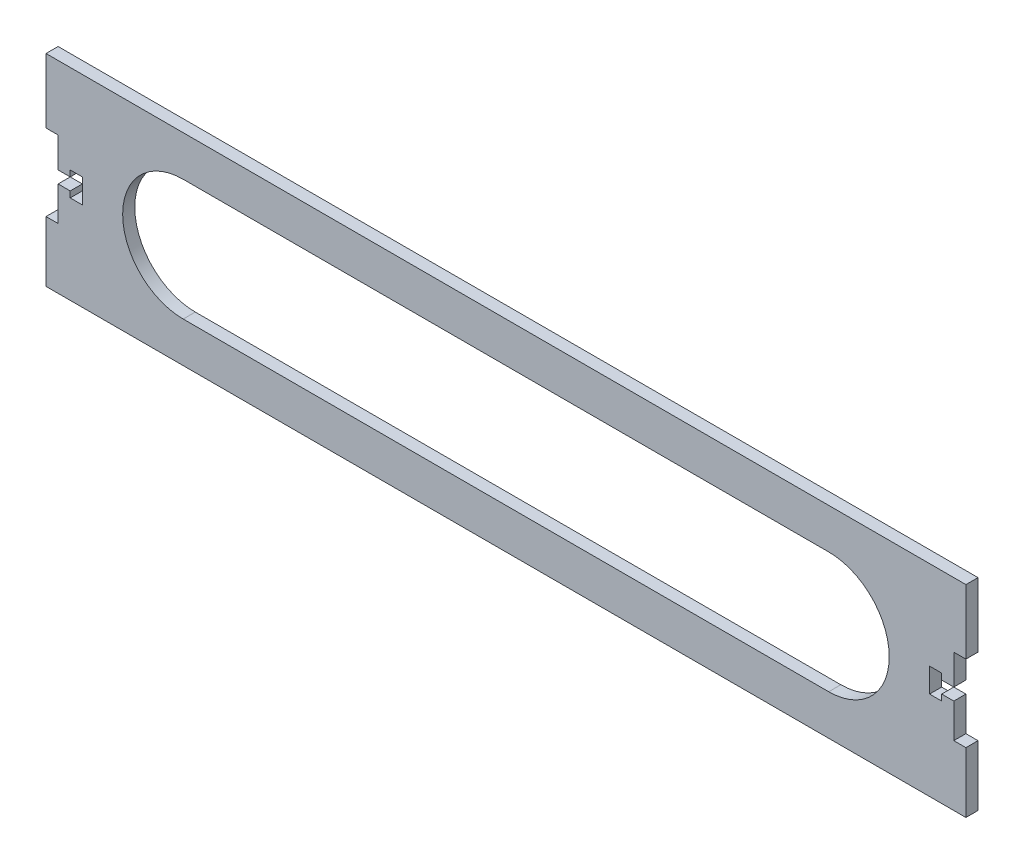
ISO-10303-21;
HEADER;
FILE_DESCRIPTION(('STEP AP214'),'2;1');
FILE_NAME('part.step','',(''),(''),'','','');
FILE_SCHEMA(('AUTOMOTIVE_DESIGN { 1 0 10303 214 1 1 1 1 }'));
ENDSEC;
DATA;
#1=APPLICATION_CONTEXT('core data for automotive mechanical design processes');
#2=APPLICATION_PROTOCOL_DEFINITION('international standard','automotive_design',2000,#1);
#3=PRODUCT_CONTEXT('',#1,'mechanical');
#4=PRODUCT('Part','Part','',(#3));
#5=PRODUCT_RELATED_PRODUCT_CATEGORY('part','',(#4));
#6=PRODUCT_DEFINITION_FORMATION('','',#4);
#7=PRODUCT_DEFINITION_CONTEXT('part definition',#1,'design');
#8=PRODUCT_DEFINITION('design','',#6,#7);
#9=PRODUCT_DEFINITION_SHAPE('','',#8);
#10=(LENGTH_UNIT() NAMED_UNIT(*) SI_UNIT(.MILLI.,.METRE.));
#11=(NAMED_UNIT(*) PLANE_ANGLE_UNIT() SI_UNIT($,.RADIAN.));
#12=(NAMED_UNIT(*) SI_UNIT($,.STERADIAN.) SOLID_ANGLE_UNIT());
#13=UNCERTAINTY_MEASURE_WITH_UNIT(LENGTH_MEASURE(1.E-05),#10,'distance_accuracy_value','');
#14=(GEOMETRIC_REPRESENTATION_CONTEXT(3) GLOBAL_UNCERTAINTY_ASSIGNED_CONTEXT((#13)) GLOBAL_UNIT_ASSIGNED_CONTEXT((#10,
#11,#12)) REPRESENTATION_CONTEXT('',''));
#15=CARTESIAN_POINT('',(0.,0.,0.));
#16=DIRECTION('',(0.,0.,1.));
#17=DIRECTION('',(1.,0.,0.));
#18=AXIS2_PLACEMENT_3D('',#15,#16,#17);
#19=CARTESIAN_POINT('',(-111.,-25.,3.));
#20=DIRECTION('',(1.,0.,0.));
#21=DIRECTION('',(0.,0.,-1.));
#22=AXIS2_PLACEMENT_3D('',#19,#20,#21);
#23=PLANE('',#22);
#24=DIRECTION('',(0.,0.,-1.));
#25=VECTOR('',#24,1.);
#26=CARTESIAN_POINT('',(-111.,-9.99999999999999,3.));
#27=LINE('',#26,#25);
#28=CARTESIAN_POINT('',(-111.,-9.99999999999999,3.));
#29=VERTEX_POINT('',#28);
#30=CARTESIAN_POINT('',(-111.,-9.99999999999999,0.));
#31=VERTEX_POINT('',#30);
#32=EDGE_CURVE('E302',#29,#31,#27,.T.);
#33=ORIENTED_EDGE('',*,*,#32,.F.);
#34=DIRECTION('',(0.,-1.,0.));
#35=VECTOR('',#34,1.);
#36=CARTESIAN_POINT('',(-111.,-25.,3.));
#37=LINE('',#36,#35);
#38=CARTESIAN_POINT('',(-111.,-1.50000000000002,3.));
#39=VERTEX_POINT('',#38);
#40=EDGE_CURVE('E381',#39,#29,#37,.T.);
#41=ORIENTED_EDGE('',*,*,#40,.F.);
#42=DIRECTION('',(0.,0.,-1.));
#43=VECTOR('',#42,1.);
#44=CARTESIAN_POINT('',(-111.,-1.50000000000002,3.));
#45=LINE('',#44,#43);
#46=CARTESIAN_POINT('',(-111.,-1.50000000000002,0.));
#47=VERTEX_POINT('',#46);
#48=EDGE_CURVE('E469',#39,#47,#45,.T.);
#49=ORIENTED_EDGE('',*,*,#48,.T.);
#50=DIRECTION('',(0.,-1.,0.));
#51=VECTOR('',#50,1.);
#52=CARTESIAN_POINT('',(-111.,-25.,0.));
#53=LINE('',#52,#51);
#54=EDGE_CURVE('E422',#47,#31,#53,.T.);
#55=ORIENTED_EDGE('',*,*,#54,.T.);
#56=EDGE_LOOP('',(#33,#41,#49,#55));
#57=FACE_BOUND('',#56,.T.);
#58=ADVANCED_FACE('F39',(#57),#23,.F.);
#59=CARTESIAN_POINT('',(-111.,1.5,3.));
#60=DIRECTION('',(1.,0.,0.));
#61=DIRECTION('',(0.,0.,-1.));
#62=AXIS2_PLACEMENT_3D('',#59,#60,#61);
#63=PLANE('',#62);
#64=DIRECTION('',(0.,0.,1.));
#65=VECTOR('',#64,1.);
#66=CARTESIAN_POINT('',(-111.,9.00000000000001,0.));
#67=LINE('',#66,#65);
#68=CARTESIAN_POINT('',(-111.,9.00000000000001,0.));
#69=VERTEX_POINT('',#68);
#70=CARTESIAN_POINT('',(-111.,9.00000000000001,3.));
#71=VERTEX_POINT('',#70);
#72=EDGE_CURVE('E304',#69,#71,#67,.T.);
#73=ORIENTED_EDGE('',*,*,#72,.F.);
#74=DIRECTION('',(0.,-1.,0.));
#75=VECTOR('',#74,1.);
#76=CARTESIAN_POINT('',(-111.,1.5,0.));
#77=LINE('',#76,#75);
#78=CARTESIAN_POINT('',(-111.,1.5,0.));
#79=VERTEX_POINT('',#78);
#80=EDGE_CURVE('E363',#69,#79,#77,.T.);
#81=ORIENTED_EDGE('',*,*,#80,.T.);
#82=DIRECTION('',(0.,0.,-1.));
#83=VECTOR('',#82,1.);
#84=CARTESIAN_POINT('',(-111.,1.5,3.));
#85=LINE('',#84,#83);
#86=CARTESIAN_POINT('',(-111.,1.5,3.));
#87=VERTEX_POINT('',#86);
#88=EDGE_CURVE('E11',#87,#79,#85,.T.);
#89=ORIENTED_EDGE('',*,*,#88,.F.);
#90=DIRECTION('',(0.,-1.,0.));
#91=VECTOR('',#90,1.);
#92=CARTESIAN_POINT('',(-111.,1.5,3.));
#93=LINE('',#92,#91);
#94=EDGE_CURVE('E364',#71,#87,#93,.T.);
#95=ORIENTED_EDGE('',*,*,#94,.F.);
#96=EDGE_LOOP('',(#73,#81,#89,#95));
#97=FACE_BOUND('',#96,.T.);
#98=ADVANCED_FACE('F41',(#97),#63,.F.);
#99=CARTESIAN_POINT('',(0.,0.,3.));
#100=DIRECTION('',(0.,0.,1.));
#101=DIRECTION('',(1.,0.,0.));
#102=AXIS2_PLACEMENT_3D('',#99,#100,#101);
#103=PLANE('',#102);
#104=DIRECTION('',(-1.,0.,0.));
#105=VECTOR('',#104,1.);
#106=CARTESIAN_POINT('',(111.,25.,3.));
#107=LINE('',#106,#105);
#108=CARTESIAN_POINT('',(114.,25.,3.));
#109=VERTEX_POINT('',#108);
#110=CARTESIAN_POINT('',(-114.,25.,3.));
#111=VERTEX_POINT('',#110);
#112=EDGE_CURVE('E404',#109,#111,#107,.T.);
#113=ORIENTED_EDGE('',*,*,#112,.T.);
#114=DIRECTION('',(0.,1.,0.));
#115=VECTOR('',#114,1.);
#116=CARTESIAN_POINT('',(-114.,9.00000000000001,3.));
#117=LINE('',#116,#115);
#118=CARTESIAN_POINT('',(-114.,9.00000000000001,3.));
#119=VERTEX_POINT('',#118);
#120=EDGE_CURVE('E314',#119,#111,#117,.T.);
#121=ORIENTED_EDGE('',*,*,#120,.F.);
#122=DIRECTION('',(1.,0.,0.));
#123=VECTOR('',#122,1.);
#124=CARTESIAN_POINT('',(-114.,9.00000000000001,3.));
#125=LINE('',#124,#123);
#126=EDGE_CURVE('E324',#119,#71,#125,.T.);
#127=ORIENTED_EDGE('',*,*,#126,.T.);
#128=ORIENTED_EDGE('',*,*,#94,.T.);
#129=DIRECTION('',(1.,0.,0.));
#130=VECTOR('',#129,1.);
#131=CARTESIAN_POINT('',(-111.,1.5,3.));
#132=LINE('',#131,#130);
#133=CARTESIAN_POINT('',(-108.,1.5,3.));
#134=VERTEX_POINT('',#133);
#135=EDGE_CURVE('E366',#87,#134,#132,.T.);
#136=ORIENTED_EDGE('',*,*,#135,.T.);
#137=DIRECTION('',(0.,1.,0.));
#138=VECTOR('',#137,1.);
#139=CARTESIAN_POINT('',(-108.,1.5,3.));
#140=LINE('',#139,#138);
#141=CARTESIAN_POINT('',(-108.,3.,3.));
#142=VERTEX_POINT('',#141);
#143=EDGE_CURVE('E369',#134,#142,#140,.T.);
#144=ORIENTED_EDGE('',*,*,#143,.T.);
#145=DIRECTION('',(1.,0.,0.));
#146=VECTOR('',#145,1.);
#147=CARTESIAN_POINT('',(-108.,3.,3.));
#148=LINE('',#147,#146);
#149=CARTESIAN_POINT('',(-105.,3.,3.));
#150=VERTEX_POINT('',#149);
#151=EDGE_CURVE('E371',#142,#150,#148,.T.);
#152=ORIENTED_EDGE('',*,*,#151,.T.);
#153=DIRECTION('',(0.,-1.,0.));
#154=VECTOR('',#153,1.);
#155=CARTESIAN_POINT('',(-105.,3.,3.));
#156=LINE('',#155,#154);
#157=CARTESIAN_POINT('',(-105.,-3.,3.));
#158=VERTEX_POINT('',#157);
#159=EDGE_CURVE('E373',#150,#158,#156,.T.);
#160=ORIENTED_EDGE('',*,*,#159,.T.);
#161=DIRECTION('',(-1.,0.,0.));
#162=VECTOR('',#161,1.);
#163=CARTESIAN_POINT('',(-108.,-3.00000000000001,3.));
#164=LINE('',#163,#162);
#165=CARTESIAN_POINT('',(-108.,-3.00000000000001,3.));
#166=VERTEX_POINT('',#165);
#167=EDGE_CURVE('E375',#158,#166,#164,.T.);
#168=ORIENTED_EDGE('',*,*,#167,.T.);
#169=DIRECTION('',(0.,1.,0.));
#170=VECTOR('',#169,1.);
#171=CARTESIAN_POINT('',(-108.,-1.50000000000001,3.));
#172=LINE('',#171,#170);
#173=CARTESIAN_POINT('',(-108.,-1.50000000000001,3.));
#174=VERTEX_POINT('',#173);
#175=EDGE_CURVE('E377',#166,#174,#172,.T.);
#176=ORIENTED_EDGE('',*,*,#175,.T.);
#177=DIRECTION('',(-1.,0.,0.));
#178=VECTOR('',#177,1.);
#179=CARTESIAN_POINT('',(-111.,-1.50000000000002,3.));
#180=LINE('',#179,#178);
#181=EDGE_CURVE('E379',#174,#39,#180,.T.);
#182=ORIENTED_EDGE('',*,*,#181,.T.);
#183=ORIENTED_EDGE('',*,*,#40,.T.);
#184=DIRECTION('',(1.,0.,0.));
#185=VECTOR('',#184,1.);
#186=CARTESIAN_POINT('',(-114.,-9.99999999999999,3.));
#187=LINE('',#186,#185);
#188=CARTESIAN_POINT('',(-114.,-9.99999999999999,3.));
#189=VERTEX_POINT('',#188);
#190=EDGE_CURVE('E296',#189,#29,#187,.T.);
#191=ORIENTED_EDGE('',*,*,#190,.F.);
#192=DIRECTION('',(0.,1.,0.));
#193=VECTOR('',#192,1.);
#194=CARTESIAN_POINT('',(-114.,-25.,3.00000000000003));
#195=LINE('',#194,#193);
#196=CARTESIAN_POINT('',(-114.,-25.,3.00000000000003));
#197=VERTEX_POINT('',#196);
#198=EDGE_CURVE('E307',#197,#189,#195,.T.);
#199=ORIENTED_EDGE('',*,*,#198,.F.);
#200=DIRECTION('',(1.,0.,0.));
#201=VECTOR('',#200,1.);
#202=CARTESIAN_POINT('',(111.,-25.,3.));
#203=LINE('',#202,#201);
#204=CARTESIAN_POINT('',(114.,-25.,3.00000000000003));
#205=VERTEX_POINT('',#204);
#206=EDGE_CURVE('E384',#197,#205,#203,.T.);
#207=ORIENTED_EDGE('',*,*,#206,.T.);
#208=DIRECTION('',(0.,1.,0.));
#209=VECTOR('',#208,1.);
#210=CARTESIAN_POINT('',(114.,-25.,3.00000000000003));
#211=LINE('',#210,#209);
#212=CARTESIAN_POINT('',(114.,-9.99999999999999,3.));
#213=VERTEX_POINT('',#212);
#214=EDGE_CURVE('E271',#205,#213,#211,.T.);
#215=ORIENTED_EDGE('',*,*,#214,.T.);
#216=DIRECTION('',(-1.,0.,0.));
#217=VECTOR('',#216,1.);
#218=CARTESIAN_POINT('',(114.,-9.99999999999999,3.));
#219=LINE('',#218,#217);
#220=CARTESIAN_POINT('',(111.,-9.99999999999999,3.));
#221=VERTEX_POINT('',#220);
#222=EDGE_CURVE('E259',#213,#221,#219,.T.);
#223=ORIENTED_EDGE('',*,*,#222,.T.);
#224=DIRECTION('',(0.,1.,0.));
#225=VECTOR('',#224,1.);
#226=CARTESIAN_POINT('',(111.,-25.,3.));
#227=LINE('',#226,#225);
#228=CARTESIAN_POINT('',(111.,-1.50000000000002,3.));
#229=VERTEX_POINT('',#228);
#230=EDGE_CURVE('E54',#221,#229,#227,.T.);
#231=ORIENTED_EDGE('',*,*,#230,.T.);
#232=DIRECTION('',(-1.,0.,0.));
#233=VECTOR('',#232,1.);
#234=CARTESIAN_POINT('',(111.,-1.50000000000002,3.));
#235=LINE('',#234,#233);
#236=CARTESIAN_POINT('',(108.,-1.50000000000001,3.));
#237=VERTEX_POINT('',#236);
#238=EDGE_CURVE('E387',#229,#237,#235,.T.);
#239=ORIENTED_EDGE('',*,*,#238,.T.);
#240=DIRECTION('',(0.,-1.,0.));
#241=VECTOR('',#240,1.);
#242=CARTESIAN_POINT('',(108.,-1.50000000000001,3.));
#243=LINE('',#242,#241);
#244=CARTESIAN_POINT('',(108.,-3.00000000000001,3.));
#245=VERTEX_POINT('',#244);
#246=EDGE_CURVE('E389',#237,#245,#243,.T.);
#247=ORIENTED_EDGE('',*,*,#246,.T.);
#248=DIRECTION('',(-1.,0.,0.));
#249=VECTOR('',#248,1.);
#250=CARTESIAN_POINT('',(108.,-3.00000000000001,3.));
#251=LINE('',#250,#249);
#252=CARTESIAN_POINT('',(105.,-3.,3.));
#253=VERTEX_POINT('',#252);
#254=EDGE_CURVE('E391',#245,#253,#251,.T.);
#255=ORIENTED_EDGE('',*,*,#254,.T.);
#256=DIRECTION('',(0.,1.,0.));
#257=VECTOR('',#256,1.);
#258=CARTESIAN_POINT('',(105.,3.,3.));
#259=LINE('',#258,#257);
#260=CARTESIAN_POINT('',(105.,3.,3.));
#261=VERTEX_POINT('',#260);
#262=EDGE_CURVE('E393',#253,#261,#259,.T.);
#263=ORIENTED_EDGE('',*,*,#262,.T.);
#264=DIRECTION('',(1.,0.,0.));
#265=VECTOR('',#264,1.);
#266=CARTESIAN_POINT('',(108.,3.,3.));
#267=LINE('',#266,#265);
#268=CARTESIAN_POINT('',(108.,3.,3.));
#269=VERTEX_POINT('',#268);
#270=EDGE_CURVE('E395',#261,#269,#267,.T.);
#271=ORIENTED_EDGE('',*,*,#270,.T.);
#272=DIRECTION('',(0.,-1.,0.));
#273=VECTOR('',#272,1.);
#274=CARTESIAN_POINT('',(108.,1.5,3.));
#275=LINE('',#274,#273);
#276=CARTESIAN_POINT('',(108.,1.5,3.));
#277=VERTEX_POINT('',#276);
#278=EDGE_CURVE('E397',#269,#277,#275,.T.);
#279=ORIENTED_EDGE('',*,*,#278,.T.);
#280=DIRECTION('',(1.,0.,0.));
#281=VECTOR('',#280,1.);
#282=CARTESIAN_POINT('',(111.,1.5,3.));
#283=LINE('',#282,#281);
#284=CARTESIAN_POINT('',(111.,1.5,3.));
#285=VERTEX_POINT('',#284);
#286=EDGE_CURVE('E399',#277,#285,#283,.T.);
#287=ORIENTED_EDGE('',*,*,#286,.T.);
#288=DIRECTION('',(0.,1.,0.));
#289=VECTOR('',#288,1.);
#290=CARTESIAN_POINT('',(111.,1.5,3.));
#291=LINE('',#290,#289);
#292=CARTESIAN_POINT('',(111.,9.00000000000001,3.));
#293=VERTEX_POINT('',#292);
#294=EDGE_CURVE('E401',#285,#293,#291,.T.);
#295=ORIENTED_EDGE('',*,*,#294,.T.);
#296=DIRECTION('',(-1.,0.,0.));
#297=VECTOR('',#296,1.);
#298=CARTESIAN_POINT('',(114.,9.00000000000001,3.));
#299=LINE('',#298,#297);
#300=CARTESIAN_POINT('',(114.,9.00000000000001,3.));
#301=VERTEX_POINT('',#300);
#302=EDGE_CURVE('E294',#301,#293,#299,.T.);
#303=ORIENTED_EDGE('',*,*,#302,.F.);
#304=DIRECTION('',(0.,1.,0.));
#305=VECTOR('',#304,1.);
#306=CARTESIAN_POINT('',(114.,9.00000000000001,3.));
#307=LINE('',#306,#305);
#308=EDGE_CURVE('E278',#301,#109,#307,.T.);
#309=ORIENTED_EDGE('',*,*,#308,.T.);
#310=EDGE_LOOP('',(#113,#121,#127,#128,#136,#144,#152,#160,#168,#176,#182,#183,#191,#199,#207,
#215,#223,#231,#239,#247,#255,#263,#271,#279,#287,#295,#303,#309));
#311=FACE_BOUND('',#310,.T.);
#312=DIRECTION('',(-1.,0.,0.));
#313=VECTOR('',#312,1.);
#314=CARTESIAN_POINT('',(80.,15.,3.));
#315=LINE('',#314,#313);
#316=CARTESIAN_POINT('',(80.,15.,3.));
#317=VERTEX_POINT('',#316);
#318=CARTESIAN_POINT('',(-80.,15.,3.));
#319=VERTEX_POINT('',#318);
#320=EDGE_CURVE('E335',#317,#319,#315,.T.);
#321=ORIENTED_EDGE('',*,*,#320,.F.);
#322=CARTESIAN_POINT('',(80.,0.,3.));
#323=DIRECTION('',(0.,0.,1.));
#324=DIRECTION('',(1.,0.,0.));
#325=AXIS2_PLACEMENT_3D('',#322,#323,#324);
#326=CIRCLE('',#325,15.);
#327=CARTESIAN_POINT('',(80.,-15.,3.));
#328=VERTEX_POINT('',#327);
#329=EDGE_CURVE('E333',#328,#317,#326,.T.);
#330=ORIENTED_EDGE('',*,*,#329,.F.);
#331=DIRECTION('',(1.,0.,0.));
#332=VECTOR('',#331,1.);
#333=CARTESIAN_POINT('',(80.,-15.,3.));
#334=LINE('',#333,#332);
#335=CARTESIAN_POINT('',(-80.,-15.,3.));
#336=VERTEX_POINT('',#335);
#337=EDGE_CURVE('E341',#336,#328,#334,.T.);
#338=ORIENTED_EDGE('',*,*,#337,.F.);
#339=CARTESIAN_POINT('',(-80.,0.,3.));
#340=DIRECTION('',(0.,0.,1.));
#341=DIRECTION('',(1.,0.,0.));
#342=AXIS2_PLACEMENT_3D('',#339,#340,#341);
#343=CIRCLE('',#342,15.);
#344=EDGE_CURVE('E338',#319,#336,#343,.T.);
#345=ORIENTED_EDGE('',*,*,#344,.F.);
#346=EDGE_LOOP('',(#321,#330,#338,#345));
#347=FACE_BOUND('',#346,.T.);
#348=ADVANCED_FACE('F509',(#311,#347),#103,.T.);
#349=CARTESIAN_POINT('',(0.,0.,0.));
#350=DIRECTION('',(0.,0.,1.));
#351=DIRECTION('',(1.,0.,0.));
#352=AXIS2_PLACEMENT_3D('',#349,#350,#351);
#353=PLANE('',#352);
#354=ORIENTED_EDGE('',*,*,#80,.F.);
#355=DIRECTION('',(1.,0.,0.));
#356=VECTOR('',#355,1.);
#357=CARTESIAN_POINT('',(-114.,9.00000000000001,0.));
#358=LINE('',#357,#356);
#359=CARTESIAN_POINT('',(-114.,9.00000000000001,0.));
#360=VERTEX_POINT('',#359);
#361=EDGE_CURVE('E329',#360,#69,#358,.T.);
#362=ORIENTED_EDGE('',*,*,#361,.F.);
#363=DIRECTION('',(0.,-1.,0.));
#364=VECTOR('',#363,1.);
#365=CARTESIAN_POINT('',(-114.,9.00000000000001,0.));
#366=LINE('',#365,#364);
#367=CARTESIAN_POINT('',(-114.,25.,0.));
#368=VERTEX_POINT('',#367);
#369=EDGE_CURVE('E320',#368,#360,#366,.T.);
#370=ORIENTED_EDGE('',*,*,#369,.F.);
#371=DIRECTION('',(-1.,0.,0.));
#372=VECTOR('',#371,1.);
#373=CARTESIAN_POINT('',(111.,25.,0.));
#374=LINE('',#373,#372);
#375=CARTESIAN_POINT('',(114.,25.,0.));
#376=VERTEX_POINT('',#375);
#377=EDGE_CURVE('E367',#376,#368,#374,.T.);
#378=ORIENTED_EDGE('',*,*,#377,.F.);
#379=DIRECTION('',(0.,-1.,0.));
#380=VECTOR('',#379,1.);
#381=CARTESIAN_POINT('',(114.,9.00000000000001,0.));
#382=LINE('',#381,#380);
#383=CARTESIAN_POINT('',(114.,9.00000000000001,0.));
#384=VERTEX_POINT('',#383);
#385=EDGE_CURVE('E284',#376,#384,#382,.T.);
#386=ORIENTED_EDGE('',*,*,#385,.T.);
#387=DIRECTION('',(-1.,0.,0.));
#388=VECTOR('',#387,1.);
#389=CARTESIAN_POINT('',(114.,9.00000000000001,0.));
#390=LINE('',#389,#388);
#391=CARTESIAN_POINT('',(111.,9.00000000000001,0.));
#392=VERTEX_POINT('',#391);
#393=EDGE_CURVE('E290',#384,#392,#390,.T.);
#394=ORIENTED_EDGE('',*,*,#393,.T.);
#395=DIRECTION('',(0.,1.,0.));
#396=VECTOR('',#395,1.);
#397=CARTESIAN_POINT('',(111.,1.5,0.));
#398=LINE('',#397,#396);
#399=CARTESIAN_POINT('',(111.,1.5,0.));
#400=VERTEX_POINT('',#399);
#401=EDGE_CURVE('E442',#400,#392,#398,.T.);
#402=ORIENTED_EDGE('',*,*,#401,.F.);
#403=DIRECTION('',(1.,0.,0.));
#404=VECTOR('',#403,1.);
#405=CARTESIAN_POINT('',(111.,1.5,0.));
#406=LINE('',#405,#404);
#407=CARTESIAN_POINT('',(108.,1.5,0.));
#408=VERTEX_POINT('',#407);
#409=EDGE_CURVE('E440',#408,#400,#406,.T.);
#410=ORIENTED_EDGE('',*,*,#409,.F.);
#411=DIRECTION('',(0.,-1.,0.));
#412=VECTOR('',#411,1.);
#413=CARTESIAN_POINT('',(108.,1.5,0.));
#414=LINE('',#413,#412);
#415=CARTESIAN_POINT('',(108.,3.,0.));
#416=VERTEX_POINT('',#415);
#417=EDGE_CURVE('E438',#416,#408,#414,.T.);
#418=ORIENTED_EDGE('',*,*,#417,.F.);
#419=DIRECTION('',(1.,0.,0.));
#420=VECTOR('',#419,1.);
#421=CARTESIAN_POINT('',(108.,3.,0.));
#422=LINE('',#421,#420);
#423=CARTESIAN_POINT('',(105.,3.,0.));
#424=VERTEX_POINT('',#423);
#425=EDGE_CURVE('E436',#424,#416,#422,.T.);
#426=ORIENTED_EDGE('',*,*,#425,.F.);
#427=DIRECTION('',(0.,1.,0.));
#428=VECTOR('',#427,1.);
#429=CARTESIAN_POINT('',(105.,3.,0.));
#430=LINE('',#429,#428);
#431=CARTESIAN_POINT('',(105.,-3.,0.));
#432=VERTEX_POINT('',#431);
#433=EDGE_CURVE('E434',#432,#424,#430,.T.);
#434=ORIENTED_EDGE('',*,*,#433,.F.);
#435=DIRECTION('',(-1.,0.,0.));
#436=VECTOR('',#435,1.);
#437=CARTESIAN_POINT('',(108.,-3.00000000000001,0.));
#438=LINE('',#437,#436);
#439=CARTESIAN_POINT('',(108.,-3.00000000000001,0.));
#440=VERTEX_POINT('',#439);
#441=EDGE_CURVE('E432',#440,#432,#438,.T.);
#442=ORIENTED_EDGE('',*,*,#441,.F.);
#443=DIRECTION('',(0.,-1.,0.));
#444=VECTOR('',#443,1.);
#445=CARTESIAN_POINT('',(108.,-1.50000000000001,0.));
#446=LINE('',#445,#444);
#447=CARTESIAN_POINT('',(108.,-1.50000000000001,0.));
#448=VERTEX_POINT('',#447);
#449=EDGE_CURVE('E430',#448,#440,#446,.T.);
#450=ORIENTED_EDGE('',*,*,#449,.F.);
#451=DIRECTION('',(-1.,0.,0.));
#452=VECTOR('',#451,1.);
#453=CARTESIAN_POINT('',(111.,-1.50000000000002,0.));
#454=LINE('',#453,#452);
#455=CARTESIAN_POINT('',(111.,-1.50000000000002,0.));
#456=VERTEX_POINT('',#455);
#457=EDGE_CURVE('E428',#456,#448,#454,.T.);
#458=ORIENTED_EDGE('',*,*,#457,.F.);
#459=DIRECTION('',(0.,1.,0.));
#460=VECTOR('',#459,1.);
#461=CARTESIAN_POINT('',(111.,-25.,0.));
#462=LINE('',#461,#460);
#463=CARTESIAN_POINT('',(111.,-9.99999999999999,0.));
#464=VERTEX_POINT('',#463);
#465=EDGE_CURVE('E255',#464,#456,#462,.T.);
#466=ORIENTED_EDGE('',*,*,#465,.F.);
#467=DIRECTION('',(-1.,0.,0.));
#468=VECTOR('',#467,1.);
#469=CARTESIAN_POINT('',(114.,-9.99999999999999,0.));
#470=LINE('',#469,#468);
#471=CARTESIAN_POINT('',(114.,-9.99999999999999,0.));
#472=VERTEX_POINT('',#471);
#473=EDGE_CURVE('E247',#472,#464,#470,.T.);
#474=ORIENTED_EDGE('',*,*,#473,.F.);
#475=DIRECTION('',(0.,-1.,0.));
#476=VECTOR('',#475,1.);
#477=CARTESIAN_POINT('',(114.,-25.,0.));
#478=LINE('',#477,#476);
#479=CARTESIAN_POINT('',(114.,-25.,0.));
#480=VERTEX_POINT('',#479);
#481=EDGE_CURVE('E252',#472,#480,#478,.T.);
#482=ORIENTED_EDGE('',*,*,#481,.T.);
#483=DIRECTION('',(1.,0.,0.));
#484=VECTOR('',#483,1.);
#485=CARTESIAN_POINT('',(111.,-25.,0.));
#486=LINE('',#485,#484);
#487=CARTESIAN_POINT('',(-114.,-25.,0.));
#488=VERTEX_POINT('',#487);
#489=EDGE_CURVE('E425',#488,#480,#486,.T.);
#490=ORIENTED_EDGE('',*,*,#489,.F.);
#491=DIRECTION('',(0.,-1.,0.));
#492=VECTOR('',#491,1.);
#493=CARTESIAN_POINT('',(-114.,-25.,0.));
#494=LINE('',#493,#492);
#495=CARTESIAN_POINT('',(-114.,-9.99999999999999,0.));
#496=VERTEX_POINT('',#495);
#497=EDGE_CURVE('E305',#496,#488,#494,.T.);
#498=ORIENTED_EDGE('',*,*,#497,.F.);
#499=DIRECTION('',(1.,0.,0.));
#500=VECTOR('',#499,1.);
#501=CARTESIAN_POINT('',(-114.,-9.99999999999999,0.));
#502=LINE('',#501,#500);
#503=EDGE_CURVE('E298',#496,#31,#502,.T.);
#504=ORIENTED_EDGE('',*,*,#503,.T.);
#505=ORIENTED_EDGE('',*,*,#54,.F.);
#506=DIRECTION('',(-1.,0.,0.));
#507=VECTOR('',#506,1.);
#508=CARTESIAN_POINT('',(-111.,-1.50000000000002,0.));
#509=LINE('',#508,#507);
#510=CARTESIAN_POINT('',(-108.,-1.50000000000001,0.));
#511=VERTEX_POINT('',#510);
#512=EDGE_CURVE('E420',#511,#47,#509,.T.);
#513=ORIENTED_EDGE('',*,*,#512,.F.);
#514=DIRECTION('',(0.,1.,0.));
#515=VECTOR('',#514,1.);
#516=CARTESIAN_POINT('',(-108.,-1.50000000000001,0.));
#517=LINE('',#516,#515);
#518=CARTESIAN_POINT('',(-108.,-3.00000000000001,0.));
#519=VERTEX_POINT('',#518);
#520=EDGE_CURVE('E418',#519,#511,#517,.T.);
#521=ORIENTED_EDGE('',*,*,#520,.F.);
#522=DIRECTION('',(-1.,0.,0.));
#523=VECTOR('',#522,1.);
#524=CARTESIAN_POINT('',(-108.,-3.00000000000001,0.));
#525=LINE('',#524,#523);
#526=CARTESIAN_POINT('',(-105.,-3.,0.));
#527=VERTEX_POINT('',#526);
#528=EDGE_CURVE('E416',#527,#519,#525,.T.);
#529=ORIENTED_EDGE('',*,*,#528,.F.);
#530=DIRECTION('',(0.,-1.,0.));
#531=VECTOR('',#530,1.);
#532=CARTESIAN_POINT('',(-105.,3.,0.));
#533=LINE('',#532,#531);
#534=CARTESIAN_POINT('',(-105.,3.,0.));
#535=VERTEX_POINT('',#534);
#536=EDGE_CURVE('E414',#535,#527,#533,.T.);
#537=ORIENTED_EDGE('',*,*,#536,.F.);
#538=DIRECTION('',(1.,0.,0.));
#539=VECTOR('',#538,1.);
#540=CARTESIAN_POINT('',(-108.,3.,0.));
#541=LINE('',#540,#539);
#542=CARTESIAN_POINT('',(-108.,3.,0.));
#543=VERTEX_POINT('',#542);
#544=EDGE_CURVE('E412',#543,#535,#541,.T.);
#545=ORIENTED_EDGE('',*,*,#544,.F.);
#546=DIRECTION('',(0.,1.,0.));
#547=VECTOR('',#546,1.);
#548=CARTESIAN_POINT('',(-108.,1.5,0.));
#549=LINE('',#548,#547);
#550=CARTESIAN_POINT('',(-108.,1.5,0.));
#551=VERTEX_POINT('',#550);
#552=EDGE_CURVE('E410',#551,#543,#549,.T.);
#553=ORIENTED_EDGE('',*,*,#552,.F.);
#554=DIRECTION('',(1.,0.,0.));
#555=VECTOR('',#554,1.);
#556=CARTESIAN_POINT('',(-111.,1.5,0.));
#557=LINE('',#556,#555);
#558=EDGE_CURVE('E408',#79,#551,#557,.T.);
#559=ORIENTED_EDGE('',*,*,#558,.F.);
#560=EDGE_LOOP('',(#354,#362,#370,#378,#386,#394,#402,#410,#418,#426,#434,#442,#450,#458,#466,
#474,#482,#490,#498,#504,#505,#513,#521,#529,#537,#545,#553,#559));
#561=FACE_BOUND('',#560,.T.);
#562=CARTESIAN_POINT('',(80.,0.,0.));
#563=DIRECTION('',(0.,0.,1.));
#564=DIRECTION('',(1.,0.,0.));
#565=AXIS2_PLACEMENT_3D('',#562,#563,#564);
#566=CIRCLE('',#565,15.);
#567=CARTESIAN_POINT('',(80.,-15.,0.));
#568=VERTEX_POINT('',#567);
#569=CARTESIAN_POINT('',(80.,15.,0.));
#570=VERTEX_POINT('',#569);
#571=EDGE_CURVE('E332',#568,#570,#566,.T.);
#572=ORIENTED_EDGE('',*,*,#571,.T.);
#573=DIRECTION('',(-1.,0.,0.));
#574=VECTOR('',#573,1.);
#575=CARTESIAN_POINT('',(80.,15.,0.));
#576=LINE('',#575,#574);
#577=CARTESIAN_POINT('',(-80.,15.,0.));
#578=VERTEX_POINT('',#577);
#579=EDGE_CURVE('E346',#570,#578,#576,.T.);
#580=ORIENTED_EDGE('',*,*,#579,.T.);
#581=CARTESIAN_POINT('',(-80.,0.,0.));
#582=DIRECTION('',(0.,0.,1.));
#583=DIRECTION('',(1.,0.,0.));
#584=AXIS2_PLACEMENT_3D('',#581,#582,#583);
#585=CIRCLE('',#584,15.);
#586=CARTESIAN_POINT('',(-80.,-15.,0.));
#587=VERTEX_POINT('',#586);
#588=EDGE_CURVE('E349',#578,#587,#585,.T.);
#589=ORIENTED_EDGE('',*,*,#588,.T.);
#590=DIRECTION('',(1.,0.,0.));
#591=VECTOR('',#590,1.);
#592=CARTESIAN_POINT('',(80.,-15.,0.));
#593=LINE('',#592,#591);
#594=EDGE_CURVE('E336',#587,#568,#593,.T.);
#595=ORIENTED_EDGE('',*,*,#594,.T.);
#596=EDGE_LOOP('',(#572,#580,#589,#595));
#597=FACE_BOUND('',#596,.T.);
#598=ADVANCED_FACE('F250',(#561,#597),#353,.F.);
#599=CARTESIAN_POINT('',(-111.,1.5,3.));
#600=DIRECTION('',(0.,1.,0.));
#601=DIRECTION('',(0.,0.,1.));
#602=AXIS2_PLACEMENT_3D('',#599,#600,#601);
#603=PLANE('',#602);
#604=ORIENTED_EDGE('',*,*,#558,.T.);
#605=DIRECTION('',(0.,0.,-1.));
#606=VECTOR('',#605,1.);
#607=CARTESIAN_POINT('',(-108.,1.5,3.));
#608=LINE('',#607,#606);
#609=EDGE_CURVE('E47',#134,#551,#608,.T.);
#610=ORIENTED_EDGE('',*,*,#609,.F.);
#611=ORIENTED_EDGE('',*,*,#135,.F.);
#612=ORIENTED_EDGE('',*,*,#88,.T.);
#613=EDGE_LOOP('',(#604,#610,#611,#612));
#614=FACE_BOUND('',#613,.T.);
#615=ADVANCED_FACE('F513',(#614),#603,.F.);
#616=CARTESIAN_POINT('',(-108.,1.5,3.));
#617=DIRECTION('',(-1.,0.,0.));
#618=DIRECTION('',(0.,0.,1.));
#619=AXIS2_PLACEMENT_3D('',#616,#617,#618);
#620=PLANE('',#619);
#621=ORIENTED_EDGE('',*,*,#552,.T.);
#622=DIRECTION('',(0.,0.,-1.));
#623=VECTOR('',#622,1.);
#624=CARTESIAN_POINT('',(-108.,3.,3.));
#625=LINE('',#624,#623);
#626=EDGE_CURVE('E484',#142,#543,#625,.T.);
#627=ORIENTED_EDGE('',*,*,#626,.F.);
#628=ORIENTED_EDGE('',*,*,#143,.F.);
#629=ORIENTED_EDGE('',*,*,#609,.T.);
#630=EDGE_LOOP('',(#621,#627,#628,#629));
#631=FACE_BOUND('',#630,.T.);
#632=ADVANCED_FACE('F491',(#631),#620,.F.);
#633=CARTESIAN_POINT('',(-108.,3.,3.));
#634=DIRECTION('',(0.,1.,0.));
#635=DIRECTION('',(0.,0.,1.));
#636=AXIS2_PLACEMENT_3D('',#633,#634,#635);
#637=PLANE('',#636);
#638=ORIENTED_EDGE('',*,*,#544,.T.);
#639=DIRECTION('',(0.,0.,-1.));
#640=VECTOR('',#639,1.);
#641=CARTESIAN_POINT('',(-105.,3.,3.));
#642=LINE('',#641,#640);
#643=EDGE_CURVE('E481',#150,#535,#642,.T.);
#644=ORIENTED_EDGE('',*,*,#643,.F.);
#645=ORIENTED_EDGE('',*,*,#151,.F.);
#646=ORIENTED_EDGE('',*,*,#626,.T.);
#647=EDGE_LOOP('',(#638,#644,#645,#646));
#648=FACE_BOUND('',#647,.T.);
#649=ADVANCED_FACE('F501',(#648),#637,.F.);
#650=CARTESIAN_POINT('',(-105.,3.,3.));
#651=DIRECTION('',(1.,0.,0.));
#652=DIRECTION('',(0.,1.,0.));
#653=AXIS2_PLACEMENT_3D('',#650,#651,#652);
#654=PLANE('',#653);
#655=ORIENTED_EDGE('',*,*,#536,.T.);
#656=DIRECTION('',(0.,0.,-1.));
#657=VECTOR('',#656,1.);
#658=CARTESIAN_POINT('',(-105.,-3.,3.));
#659=LINE('',#658,#657);
#660=EDGE_CURVE('E478',#158,#527,#659,.T.);
#661=ORIENTED_EDGE('',*,*,#660,.F.);
#662=ORIENTED_EDGE('',*,*,#159,.F.);
#663=ORIENTED_EDGE('',*,*,#643,.T.);
#664=EDGE_LOOP('',(#655,#661,#662,#663));
#665=FACE_BOUND('',#664,.T.);
#666=ADVANCED_FACE('F505',(#665),#654,.F.);
#667=CARTESIAN_POINT('',(-108.,-3.00000000000001,3.));
#668=DIRECTION('',(0.,-1.,0.));
#669=DIRECTION('',(1.,0.,0.));
#670=AXIS2_PLACEMENT_3D('',#667,#668,#669);
#671=PLANE('',#670);
#672=ORIENTED_EDGE('',*,*,#528,.T.);
#673=DIRECTION('',(0.,0.,-1.));
#674=VECTOR('',#673,1.);
#675=CARTESIAN_POINT('',(-108.,-3.00000000000001,3.));
#676=LINE('',#675,#674);
#677=EDGE_CURVE('E475',#166,#519,#676,.T.);
#678=ORIENTED_EDGE('',*,*,#677,.F.);
#679=ORIENTED_EDGE('',*,*,#167,.F.);
#680=ORIENTED_EDGE('',*,*,#660,.T.);
#681=EDGE_LOOP('',(#672,#678,#679,#680));
#682=FACE_BOUND('',#681,.T.);
#683=ADVANCED_FACE('F602',(#682),#671,.F.);
#684=CARTESIAN_POINT('',(-108.,-1.50000000000001,3.));
#685=DIRECTION('',(-1.,0.,0.));
#686=DIRECTION('',(0.,-1.,0.));
#687=AXIS2_PLACEMENT_3D('',#684,#685,#686);
#688=PLANE('',#687);
#689=ORIENTED_EDGE('',*,*,#520,.T.);
#690=DIRECTION('',(0.,0.,-1.));
#691=VECTOR('',#690,1.);
#692=CARTESIAN_POINT('',(-108.,-1.50000000000001,3.));
#693=LINE('',#692,#691);
#694=EDGE_CURVE('E472',#174,#511,#693,.T.);
#695=ORIENTED_EDGE('',*,*,#694,.F.);
#696=ORIENTED_EDGE('',*,*,#175,.F.);
#697=ORIENTED_EDGE('',*,*,#677,.T.);
#698=EDGE_LOOP('',(#689,#695,#696,#697));
#699=FACE_BOUND('',#698,.T.);
#700=ADVANCED_FACE('F598',(#699),#688,.F.);
#701=CARTESIAN_POINT('',(-111.,-1.50000000000002,3.));
#702=DIRECTION('',(0.,-1.,0.));
#703=DIRECTION('',(1.,0.,0.));
#704=AXIS2_PLACEMENT_3D('',#701,#702,#703);
#705=PLANE('',#704);
#706=ORIENTED_EDGE('',*,*,#512,.T.);
#707=ORIENTED_EDGE('',*,*,#48,.F.);
#708=ORIENTED_EDGE('',*,*,#181,.F.);
#709=ORIENTED_EDGE('',*,*,#694,.T.);
#710=EDGE_LOOP('',(#706,#707,#708,#709));
#711=FACE_BOUND('',#710,.T.);
#712=ADVANCED_FACE('F584',(#711),#705,.F.);
#713=CARTESIAN_POINT('',(111.,-25.,3.));
#714=DIRECTION('',(0.,1.,0.));
#715=DIRECTION('',(-1.,0.,0.));
#716=AXIS2_PLACEMENT_3D('',#713,#714,#715);
#717=PLANE('',#716);
#718=ORIENTED_EDGE('',*,*,#489,.T.);
#719=DIRECTION('',(0.,0.,1.));
#720=VECTOR('',#719,1.);
#721=CARTESIAN_POINT('',(114.,-25.,3.00000000000003));
#722=LINE('',#721,#720);
#723=EDGE_CURVE('E268',#480,#205,#722,.T.);
#724=ORIENTED_EDGE('',*,*,#723,.T.);
#725=ORIENTED_EDGE('',*,*,#206,.F.);
#726=DIRECTION('',(0.,0.,1.));
#727=VECTOR('',#726,1.);
#728=CARTESIAN_POINT('',(-114.,-25.,3.00000000000003));
#729=LINE('',#728,#727);
#730=EDGE_CURVE('E309',#488,#197,#729,.T.);
#731=ORIENTED_EDGE('',*,*,#730,.F.);
#732=EDGE_LOOP('',(#718,#724,#725,#731));
#733=FACE_BOUND('',#732,.T.);
#734=ADVANCED_FACE('F576',(#733),#717,.F.);
#735=CARTESIAN_POINT('',(111.,-25.,3.));
#736=DIRECTION('',(-1.,0.,0.));
#737=DIRECTION('',(0.,0.,1.));
#738=AXIS2_PLACEMENT_3D('',#735,#736,#737);
#739=PLANE('',#738);
#740=ORIENTED_EDGE('',*,*,#230,.F.);
#741=DIRECTION('',(0.,0.,-1.));
#742=VECTOR('',#741,1.);
#743=CARTESIAN_POINT('',(111.,-9.99999999999999,3.));
#744=LINE('',#743,#742);
#745=EDGE_CURVE('E59',#221,#464,#744,.T.);
#746=ORIENTED_EDGE('',*,*,#745,.T.);
#747=ORIENTED_EDGE('',*,*,#465,.T.);
#748=DIRECTION('',(0.,0.,-1.));
#749=VECTOR('',#748,1.);
#750=CARTESIAN_POINT('',(111.,-1.50000000000002,3.));
#751=LINE('',#750,#749);
#752=EDGE_CURVE('E466',#229,#456,#751,.T.);
#753=ORIENTED_EDGE('',*,*,#752,.F.);
#754=EDGE_LOOP('',(#740,#746,#747,#753));
#755=FACE_BOUND('',#754,.T.);
#756=ADVANCED_FACE('F574',(#755),#739,.F.);
#757=CARTESIAN_POINT('',(111.,-1.50000000000002,3.));
#758=DIRECTION('',(0.,-1.,0.));
#759=DIRECTION('',(1.,0.,0.));
#760=AXIS2_PLACEMENT_3D('',#757,#758,#759);
#761=PLANE('',#760);
#762=ORIENTED_EDGE('',*,*,#457,.T.);
#763=DIRECTION('',(0.,0.,-1.));
#764=VECTOR('',#763,1.);
#765=CARTESIAN_POINT('',(108.,-1.50000000000001,3.));
#766=LINE('',#765,#764);
#767=EDGE_CURVE('E463',#237,#448,#766,.T.);
#768=ORIENTED_EDGE('',*,*,#767,.F.);
#769=ORIENTED_EDGE('',*,*,#238,.F.);
#770=ORIENTED_EDGE('',*,*,#752,.T.);
#771=EDGE_LOOP('',(#762,#768,#769,#770));
#772=FACE_BOUND('',#771,.T.);
#773=ADVANCED_FACE('F573',(#772),#761,.F.);
#774=CARTESIAN_POINT('',(108.,-1.50000000000001,3.));
#775=DIRECTION('',(1.,0.,0.));
#776=DIRECTION('',(0.,1.,0.));
#777=AXIS2_PLACEMENT_3D('',#774,#775,#776);
#778=PLANE('',#777);
#779=ORIENTED_EDGE('',*,*,#449,.T.);
#780=DIRECTION('',(0.,0.,-1.));
#781=VECTOR('',#780,1.);
#782=CARTESIAN_POINT('',(108.,-3.00000000000001,3.));
#783=LINE('',#782,#781);
#784=EDGE_CURVE('E460',#245,#440,#783,.T.);
#785=ORIENTED_EDGE('',*,*,#784,.F.);
#786=ORIENTED_EDGE('',*,*,#246,.F.);
#787=ORIENTED_EDGE('',*,*,#767,.T.);
#788=EDGE_LOOP('',(#779,#785,#786,#787));
#789=FACE_BOUND('',#788,.T.);
#790=ADVANCED_FACE('F568',(#789),#778,.F.);
#791=CARTESIAN_POINT('',(108.,-3.00000000000001,3.));
#792=DIRECTION('',(0.,-1.,0.));
#793=DIRECTION('',(1.,0.,0.));
#794=AXIS2_PLACEMENT_3D('',#791,#792,#793);
#795=PLANE('',#794);
#796=ORIENTED_EDGE('',*,*,#441,.T.);
#797=DIRECTION('',(0.,0.,-1.));
#798=VECTOR('',#797,1.);
#799=CARTESIAN_POINT('',(105.,-3.,3.));
#800=LINE('',#799,#798);
#801=EDGE_CURVE('E457',#253,#432,#800,.T.);
#802=ORIENTED_EDGE('',*,*,#801,.F.);
#803=ORIENTED_EDGE('',*,*,#254,.F.);
#804=ORIENTED_EDGE('',*,*,#784,.T.);
#805=EDGE_LOOP('',(#796,#802,#803,#804));
#806=FACE_BOUND('',#805,.T.);
#807=ADVANCED_FACE('F564',(#806),#795,.F.);
#808=CARTESIAN_POINT('',(105.,3.,3.));
#809=DIRECTION('',(-1.,0.,0.));
#810=DIRECTION('',(0.,-1.,0.));
#811=AXIS2_PLACEMENT_3D('',#808,#809,#810);
#812=PLANE('',#811);
#813=ORIENTED_EDGE('',*,*,#433,.T.);
#814=DIRECTION('',(0.,0.,-1.));
#815=VECTOR('',#814,1.);
#816=CARTESIAN_POINT('',(105.,3.,3.));
#817=LINE('',#816,#815);
#818=EDGE_CURVE('E454',#261,#424,#817,.T.);
#819=ORIENTED_EDGE('',*,*,#818,.F.);
#820=ORIENTED_EDGE('',*,*,#262,.F.);
#821=ORIENTED_EDGE('',*,*,#801,.T.);
#822=EDGE_LOOP('',(#813,#819,#820,#821));
#823=FACE_BOUND('',#822,.T.);
#824=ADVANCED_FACE('F560',(#823),#812,.F.);
#825=CARTESIAN_POINT('',(108.,3.,3.));
#826=DIRECTION('',(0.,1.,0.));
#827=DIRECTION('',(0.,0.,1.));
#828=AXIS2_PLACEMENT_3D('',#825,#826,#827);
#829=PLANE('',#828);
#830=ORIENTED_EDGE('',*,*,#425,.T.);
#831=DIRECTION('',(0.,0.,-1.));
#832=VECTOR('',#831,1.);
#833=CARTESIAN_POINT('',(108.,3.,3.));
#834=LINE('',#833,#832);
#835=EDGE_CURVE('E451',#269,#416,#834,.T.);
#836=ORIENTED_EDGE('',*,*,#835,.F.);
#837=ORIENTED_EDGE('',*,*,#270,.F.);
#838=ORIENTED_EDGE('',*,*,#818,.T.);
#839=EDGE_LOOP('',(#830,#836,#837,#838));
#840=FACE_BOUND('',#839,.T.);
#841=ADVANCED_FACE('F555',(#840),#829,.F.);
#842=CARTESIAN_POINT('',(108.,1.5,3.));
#843=DIRECTION('',(1.,0.,0.));
#844=DIRECTION('',(0.,0.,-1.));
#845=AXIS2_PLACEMENT_3D('',#842,#843,#844);
#846=PLANE('',#845);
#847=ORIENTED_EDGE('',*,*,#417,.T.);
#848=DIRECTION('',(0.,0.,-1.));
#849=VECTOR('',#848,1.);
#850=CARTESIAN_POINT('',(108.,1.5,3.));
#851=LINE('',#850,#849);
#852=EDGE_CURVE('E448',#277,#408,#851,.T.);
#853=ORIENTED_EDGE('',*,*,#852,.F.);
#854=ORIENTED_EDGE('',*,*,#278,.F.);
#855=ORIENTED_EDGE('',*,*,#835,.T.);
#856=EDGE_LOOP('',(#847,#853,#854,#855));
#857=FACE_BOUND('',#856,.T.);
#858=ADVANCED_FACE('F549',(#857),#846,.F.);
#859=CARTESIAN_POINT('',(111.,1.5,3.));
#860=DIRECTION('',(0.,1.,0.));
#861=DIRECTION('',(0.,0.,1.));
#862=AXIS2_PLACEMENT_3D('',#859,#860,#861);
#863=PLANE('',#862);
#864=ORIENTED_EDGE('',*,*,#409,.T.);
#865=DIRECTION('',(0.,0.,-1.));
#866=VECTOR('',#865,1.);
#867=CARTESIAN_POINT('',(111.,1.5,3.));
#868=LINE('',#867,#866);
#869=EDGE_CURVE('E406',#285,#400,#868,.T.);
#870=ORIENTED_EDGE('',*,*,#869,.F.);
#871=ORIENTED_EDGE('',*,*,#286,.F.);
#872=ORIENTED_EDGE('',*,*,#852,.T.);
#873=EDGE_LOOP('',(#864,#870,#871,#872));
#874=FACE_BOUND('',#873,.T.);
#875=ADVANCED_FACE('F545',(#874),#863,.F.);
#876=CARTESIAN_POINT('',(111.,1.5,3.));
#877=DIRECTION('',(-1.,0.,0.));
#878=DIRECTION('',(0.,0.,1.));
#879=AXIS2_PLACEMENT_3D('',#876,#877,#878);
#880=PLANE('',#879);
#881=ORIENTED_EDGE('',*,*,#401,.T.);
#882=DIRECTION('',(0.,0.,1.));
#883=VECTOR('',#882,1.);
#884=CARTESIAN_POINT('',(111.,9.00000000000001,0.));
#885=LINE('',#884,#883);
#886=EDGE_CURVE('E258',#392,#293,#885,.T.);
#887=ORIENTED_EDGE('',*,*,#886,.T.);
#888=ORIENTED_EDGE('',*,*,#294,.F.);
#889=ORIENTED_EDGE('',*,*,#869,.T.);
#890=EDGE_LOOP('',(#881,#887,#888,#889));
#891=FACE_BOUND('',#890,.T.);
#892=ADVANCED_FACE('F540',(#891),#880,.F.);
#893=CARTESIAN_POINT('',(111.,25.,3.));
#894=DIRECTION('',(0.,-1.,0.));
#895=DIRECTION('',(1.,0.,0.));
#896=AXIS2_PLACEMENT_3D('',#893,#894,#895);
#897=PLANE('',#896);
#898=ORIENTED_EDGE('',*,*,#377,.T.);
#899=DIRECTION('',(0.,0.,-1.));
#900=VECTOR('',#899,1.);
#901=CARTESIAN_POINT('',(-114.,25.,0.));
#902=LINE('',#901,#900);
#903=EDGE_CURVE('E317',#111,#368,#902,.T.);
#904=ORIENTED_EDGE('',*,*,#903,.F.);
#905=ORIENTED_EDGE('',*,*,#112,.F.);
#906=DIRECTION('',(0.,0.,-1.));
#907=VECTOR('',#906,1.);
#908=CARTESIAN_POINT('',(114.,25.,0.));
#909=LINE('',#908,#907);
#910=EDGE_CURVE('E287',#109,#376,#909,.T.);
#911=ORIENTED_EDGE('',*,*,#910,.T.);
#912=EDGE_LOOP('',(#898,#904,#905,#911));
#913=FACE_BOUND('',#912,.T.);
#914=ADVANCED_FACE('F532',(#913),#897,.F.);
#915=CARTESIAN_POINT('',(80.,0.,3.));
#916=DIRECTION('',(0.,0.,-1.));
#917=DIRECTION('',(-1.,0.,0.));
#918=AXIS2_PLACEMENT_3D('',#915,#916,#917);
#919=CYLINDRICAL_SURFACE('',#918,15.);
#920=ORIENTED_EDGE('',*,*,#571,.F.);
#921=DIRECTION('',(0.,0.,-1.));
#922=VECTOR('',#921,1.);
#923=CARTESIAN_POINT('',(80.,-15.,3.));
#924=LINE('',#923,#922);
#925=EDGE_CURVE('E343',#328,#568,#924,.T.);
#926=ORIENTED_EDGE('',*,*,#925,.F.);
#927=ORIENTED_EDGE('',*,*,#329,.T.);
#928=DIRECTION('',(0.,0.,-1.));
#929=VECTOR('',#928,1.);
#930=CARTESIAN_POINT('',(80.,15.,3.));
#931=LINE('',#930,#929);
#932=EDGE_CURVE('E360',#317,#570,#931,.T.);
#933=ORIENTED_EDGE('',*,*,#932,.T.);
#934=EDGE_LOOP('',(#920,#926,#927,#933));
#935=FACE_BOUND('',#934,.T.);
#936=ADVANCED_FACE('F625',(#935),#919,.F.);
#937=CARTESIAN_POINT('',(80.,15.,3.));
#938=DIRECTION('',(0.,-1.,0.));
#939=DIRECTION('',(0.,0.,-1.));
#940=AXIS2_PLACEMENT_3D('',#937,#938,#939);
#941=PLANE('',#940);
#942=ORIENTED_EDGE('',*,*,#579,.F.);
#943=ORIENTED_EDGE('',*,*,#932,.F.);
#944=ORIENTED_EDGE('',*,*,#320,.T.);
#945=DIRECTION('',(0.,0.,-1.));
#946=VECTOR('',#945,1.);
#947=CARTESIAN_POINT('',(-80.,15.,3.));
#948=LINE('',#947,#946);
#949=EDGE_CURVE('E358',#319,#578,#948,.T.);
#950=ORIENTED_EDGE('',*,*,#949,.T.);
#951=EDGE_LOOP('',(#942,#943,#944,#950));
#952=FACE_BOUND('',#951,.T.);
#953=ADVANCED_FACE('F675',(#952),#941,.T.);
#954=CARTESIAN_POINT('',(-80.,0.,3.));
#955=DIRECTION('',(0.,0.,-1.));
#956=DIRECTION('',(-1.,0.,0.));
#957=AXIS2_PLACEMENT_3D('',#954,#955,#956);
#958=CYLINDRICAL_SURFACE('',#957,15.);
#959=ORIENTED_EDGE('',*,*,#588,.F.);
#960=ORIENTED_EDGE('',*,*,#949,.F.);
#961=ORIENTED_EDGE('',*,*,#344,.T.);
#962=DIRECTION('',(0.,0.,-1.));
#963=VECTOR('',#962,1.);
#964=CARTESIAN_POINT('',(-80.,-15.,3.));
#965=LINE('',#964,#963);
#966=EDGE_CURVE('E356',#336,#587,#965,.T.);
#967=ORIENTED_EDGE('',*,*,#966,.T.);
#968=EDGE_LOOP('',(#959,#960,#961,#967));
#969=FACE_BOUND('',#968,.T.);
#970=ADVANCED_FACE('F684',(#969),#958,.F.);
#971=CARTESIAN_POINT('',(80.,-15.,3.));
#972=DIRECTION('',(0.,1.,0.));
#973=DIRECTION('',(0.,0.,1.));
#974=AXIS2_PLACEMENT_3D('',#971,#972,#973);
#975=PLANE('',#974);
#976=ORIENTED_EDGE('',*,*,#594,.F.);
#977=ORIENTED_EDGE('',*,*,#966,.F.);
#978=ORIENTED_EDGE('',*,*,#337,.T.);
#979=ORIENTED_EDGE('',*,*,#925,.T.);
#980=EDGE_LOOP('',(#976,#977,#978,#979));
#981=FACE_BOUND('',#980,.T.);
#982=ADVANCED_FACE('F692',(#981),#975,.T.);
#983=CARTESIAN_POINT('',(-114.,9.00000000000001,0.));
#984=DIRECTION('',(0.,1.,0.));
#985=DIRECTION('',(0.,0.,1.));
#986=AXIS2_PLACEMENT_3D('',#983,#984,#985);
#987=PLANE('',#986);
#988=ORIENTED_EDGE('',*,*,#72,.T.);
#989=ORIENTED_EDGE('',*,*,#126,.F.);
#990=DIRECTION('',(0.,0.,1.));
#991=VECTOR('',#990,1.);
#992=CARTESIAN_POINT('',(-114.,9.00000000000001,0.));
#993=LINE('',#992,#991);
#994=EDGE_CURVE('E322',#360,#119,#993,.T.);
#995=ORIENTED_EDGE('',*,*,#994,.F.);
#996=ORIENTED_EDGE('',*,*,#361,.T.);
#997=EDGE_LOOP('',(#988,#989,#995,#996));
#998=FACE_BOUND('',#997,.T.);
#999=ADVANCED_FACE('F519',(#998),#987,.F.);
#1000=CARTESIAN_POINT('',(-114.,0.,0.));
#1001=DIRECTION('',(1.,0.,0.));
#1002=DIRECTION('',(0.,0.,-1.));
#1003=AXIS2_PLACEMENT_3D('',#1000,#1001,#1002);
#1004=PLANE('',#1003);
#1005=ORIENTED_EDGE('',*,*,#120,.T.);
#1006=ORIENTED_EDGE('',*,*,#903,.T.);
#1007=ORIENTED_EDGE('',*,*,#369,.T.);
#1008=ORIENTED_EDGE('',*,*,#994,.T.);
#1009=EDGE_LOOP('',(#1005,#1006,#1007,#1008));
#1010=FACE_BOUND('',#1009,.T.);
#1011=ADVANCED_FACE('F523',(#1010),#1004,.F.);
#1012=CARTESIAN_POINT('',(-114.,-9.99999999999999,3.));
#1013=DIRECTION('',(0.,-1.,0.));
#1014=DIRECTION('',(0.,0.,-1.));
#1015=AXIS2_PLACEMENT_3D('',#1012,#1013,#1014);
#1016=PLANE('',#1015);
#1017=ORIENTED_EDGE('',*,*,#32,.T.);
#1018=ORIENTED_EDGE('',*,*,#503,.F.);
#1019=DIRECTION('',(0.,0.,-1.));
#1020=VECTOR('',#1019,1.);
#1021=CARTESIAN_POINT('',(-114.,-9.99999999999999,3.));
#1022=LINE('',#1021,#1020);
#1023=EDGE_CURVE('E301',#189,#496,#1022,.T.);
#1024=ORIENTED_EDGE('',*,*,#1023,.F.);
#1025=ORIENTED_EDGE('',*,*,#190,.T.);
#1026=EDGE_LOOP('',(#1017,#1018,#1024,#1025));
#1027=FACE_BOUND('',#1026,.T.);
#1028=ADVANCED_FACE('F778',(#1027),#1016,.F.);
#1029=CARTESIAN_POINT('',(-114.,0.,0.));
#1030=DIRECTION('',(-1.,0.,0.));
#1031=DIRECTION('',(0.,0.,1.));
#1032=AXIS2_PLACEMENT_3D('',#1029,#1030,#1031);
#1033=PLANE('',#1032);
#1034=ORIENTED_EDGE('',*,*,#497,.T.);
#1035=ORIENTED_EDGE('',*,*,#730,.T.);
#1036=ORIENTED_EDGE('',*,*,#198,.T.);
#1037=ORIENTED_EDGE('',*,*,#1023,.T.);
#1038=EDGE_LOOP('',(#1034,#1035,#1036,#1037));
#1039=FACE_BOUND('',#1038,.T.);
#1040=ADVANCED_FACE('F786',(#1039),#1033,.T.);
#1041=CARTESIAN_POINT('',(114.,9.00000000000001,0.));
#1042=DIRECTION('',(0.,-1.,0.));
#1043=DIRECTION('',(0.,0.,-1.));
#1044=AXIS2_PLACEMENT_3D('',#1041,#1042,#1043);
#1045=PLANE('',#1044);
#1046=ORIENTED_EDGE('',*,*,#886,.F.);
#1047=ORIENTED_EDGE('',*,*,#393,.F.);
#1048=DIRECTION('',(0.,0.,1.));
#1049=VECTOR('',#1048,1.);
#1050=CARTESIAN_POINT('',(114.,9.00000000000001,0.));
#1051=LINE('',#1050,#1049);
#1052=EDGE_CURVE('E281',#384,#301,#1051,.T.);
#1053=ORIENTED_EDGE('',*,*,#1052,.T.);
#1054=ORIENTED_EDGE('',*,*,#302,.T.);
#1055=EDGE_LOOP('',(#1046,#1047,#1053,#1054));
#1056=FACE_BOUND('',#1055,.T.);
#1057=ADVANCED_FACE('F535',(#1056),#1045,.T.);
#1058=CARTESIAN_POINT('',(114.,0.,0.));
#1059=DIRECTION('',(-1.,0.,0.));
#1060=DIRECTION('',(0.,0.,-1.));
#1061=AXIS2_PLACEMENT_3D('',#1058,#1059,#1060);
#1062=PLANE('',#1061);
#1063=ORIENTED_EDGE('',*,*,#308,.F.);
#1064=ORIENTED_EDGE('',*,*,#1052,.F.);
#1065=ORIENTED_EDGE('',*,*,#385,.F.);
#1066=ORIENTED_EDGE('',*,*,#910,.F.);
#1067=EDGE_LOOP('',(#1063,#1064,#1065,#1066));
#1068=FACE_BOUND('',#1067,.T.);
#1069=ADVANCED_FACE('F531',(#1068),#1062,.F.);
#1070=CARTESIAN_POINT('',(114.,-9.99999999999999,3.));
#1071=DIRECTION('',(0.,1.,0.));
#1072=DIRECTION('',(0.,0.,1.));
#1073=AXIS2_PLACEMENT_3D('',#1070,#1071,#1072);
#1074=PLANE('',#1073);
#1075=ORIENTED_EDGE('',*,*,#745,.F.);
#1076=ORIENTED_EDGE('',*,*,#222,.F.);
#1077=DIRECTION('',(0.,0.,-1.));
#1078=VECTOR('',#1077,1.);
#1079=CARTESIAN_POINT('',(114.,-9.99999999999999,3.));
#1080=LINE('',#1079,#1078);
#1081=EDGE_CURVE('E265',#213,#472,#1080,.T.);
#1082=ORIENTED_EDGE('',*,*,#1081,.T.);
#1083=ORIENTED_EDGE('',*,*,#473,.T.);
#1084=EDGE_LOOP('',(#1075,#1076,#1082,#1083));
#1085=FACE_BOUND('',#1084,.T.);
#1086=ADVANCED_FACE('F270',(#1085),#1074,.T.);
#1087=CARTESIAN_POINT('',(114.,0.,0.));
#1088=DIRECTION('',(1.,0.,0.));
#1089=DIRECTION('',(0.,0.,1.));
#1090=AXIS2_PLACEMENT_3D('',#1087,#1088,#1089);
#1091=PLANE('',#1090);
#1092=ORIENTED_EDGE('',*,*,#481,.F.);
#1093=ORIENTED_EDGE('',*,*,#1081,.F.);
#1094=ORIENTED_EDGE('',*,*,#214,.F.);
#1095=ORIENTED_EDGE('',*,*,#723,.F.);
#1096=EDGE_LOOP('',(#1092,#1093,#1094,#1095));
#1097=FACE_BOUND('',#1096,.T.);
#1098=ADVANCED_FACE('F263',(#1097),#1091,.T.);
#1099=CLOSED_SHELL('',(#58,#98,#348,#598,#615,#632,#649,#666,#683,#700,#712,#734,#756,#773,#790,
#807,#824,#841,#858,#875,#892,#914,#936,#953,#970,#982,#999,#1011,#1028,#1040,#1057,#1069,#1086,#1098));
#1100=MANIFOLD_SOLID_BREP('B2',#1099);
#1101=ADVANCED_BREP_SHAPE_REPRESENTATION('',(#18,#1100),#14);
#1102=SHAPE_DEFINITION_REPRESENTATION(#9,#1101);
ENDSEC;
END-ISO-10303-21;
